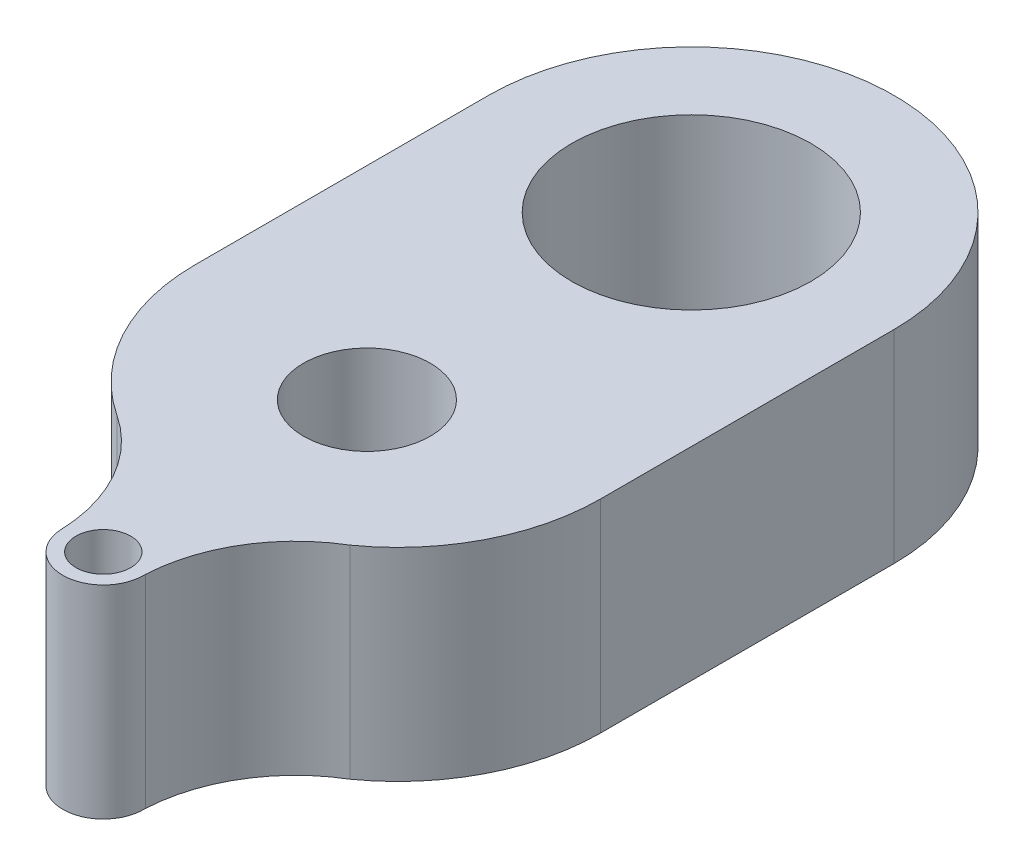
ISO-10303-21;
HEADER;
FILE_DESCRIPTION(('STEP AP214'),'2;1');
FILE_NAME('part.step','',(''),(''),'','','');
FILE_SCHEMA(('AUTOMOTIVE_DESIGN { 1 0 10303 214 1 1 1 1 }'));
ENDSEC;
DATA;
#1=APPLICATION_CONTEXT('core data for automotive mechanical design processes');
#2=APPLICATION_PROTOCOL_DEFINITION('international standard','automotive_design',2000,#1);
#3=PRODUCT_CONTEXT('',#1,'mechanical');
#4=PRODUCT('Part','Part','',(#3));
#5=PRODUCT_RELATED_PRODUCT_CATEGORY('part','',(#4));
#6=PRODUCT_DEFINITION_FORMATION('','',#4);
#7=PRODUCT_DEFINITION_CONTEXT('part definition',#1,'design');
#8=PRODUCT_DEFINITION('design','',#6,#7);
#9=PRODUCT_DEFINITION_SHAPE('','',#8);
#10=(LENGTH_UNIT() NAMED_UNIT(*) SI_UNIT(.MILLI.,.METRE.));
#11=(NAMED_UNIT(*) PLANE_ANGLE_UNIT() SI_UNIT($,.RADIAN.));
#12=(NAMED_UNIT(*) SI_UNIT($,.STERADIAN.) SOLID_ANGLE_UNIT());
#13=UNCERTAINTY_MEASURE_WITH_UNIT(LENGTH_MEASURE(1.E-05),#10,'distance_accuracy_value','');
#14=(GEOMETRIC_REPRESENTATION_CONTEXT(3) GLOBAL_UNCERTAINTY_ASSIGNED_CONTEXT((#13)) GLOBAL_UNIT_ASSIGNED_CONTEXT((#10,
#11,#12)) REPRESENTATION_CONTEXT('',''));
#15=CARTESIAN_POINT('',(0.,0.,0.));
#16=DIRECTION('',(0.,0.,1.));
#17=DIRECTION('',(1.,0.,0.));
#18=AXIS2_PLACEMENT_3D('',#15,#16,#17);
#19=CARTESIAN_POINT('',(1.27,1.27,0.));
#20=DIRECTION('',(1.,0.,0.));
#21=DIRECTION('',(0.,0.,-1.));
#22=AXIS2_PLACEMENT_3D('',#19,#20,#21);
#23=PLANE('',#22);
#24=DIRECTION('',(0.,0.,1.));
#25=VECTOR('',#24,1.);
#26=CARTESIAN_POINT('',(1.27,0.,0.));
#27=LINE('',#26,#25);
#28=CARTESIAN_POINT('',(1.27,0.,0.));
#29=VERTEX_POINT('',#28);
#30=CARTESIAN_POINT('',(1.27,0.,1.83849168136878));
#31=VERTEX_POINT('',#30);
#32=EDGE_CURVE('E148',#29,#31,#27,.T.);
#33=ORIENTED_EDGE('',*,*,#32,.F.);
#34=DIRECTION('',(0.,-1.,0.));
#35=VECTOR('',#34,1.);
#36=CARTESIAN_POINT('',(1.27,1.27,0.));
#37=LINE('',#36,#35);
#38=CARTESIAN_POINT('',(1.27,1.27,0.));
#39=VERTEX_POINT('',#38);
#40=EDGE_CURVE('E12',#39,#29,#37,.T.);
#41=ORIENTED_EDGE('',*,*,#40,.F.);
#42=DIRECTION('',(0.,0.,1.));
#43=VECTOR('',#42,1.);
#44=CARTESIAN_POINT('',(1.27,1.27,0.));
#45=LINE('',#44,#43);
#46=CARTESIAN_POINT('',(1.27,1.27,1.83849168136878));
#47=VERTEX_POINT('',#46);
#48=EDGE_CURVE('E175',#39,#47,#45,.T.);
#49=ORIENTED_EDGE('',*,*,#48,.T.);
#50=DIRECTION('',(0.,-1.,0.));
#51=VECTOR('',#50,1.);
#52=CARTESIAN_POINT('',(1.27,1.27,1.83849168136878));
#53=LINE('',#52,#51);
#54=EDGE_CURVE('E59',#47,#31,#53,.T.);
#55=ORIENTED_EDGE('',*,*,#54,.T.);
#56=EDGE_LOOP('',(#33,#41,#49,#55));
#57=FACE_BOUND('',#56,.T.);
#58=ADVANCED_FACE('F43',(#57),#23,.T.);
#59=CARTESIAN_POINT('',(0.,1.27,0.));
#60=DIRECTION('',(0.,-1.,0.));
#61=DIRECTION('',(0.,0.,-1.));
#62=AXIS2_PLACEMENT_3D('',#59,#60,#61);
#63=CYLINDRICAL_SURFACE('',#62,1.27);
#64=CARTESIAN_POINT('',(0.,0.,0.));
#65=DIRECTION('',(0.,1.,0.));
#66=DIRECTION('',(0.,0.,1.));
#67=AXIS2_PLACEMENT_3D('',#64,#65,#66);
#68=CIRCLE('',#67,1.27);
#69=CARTESIAN_POINT('',(-1.27,0.,0.));
#70=VERTEX_POINT('',#69);
#71=EDGE_CURVE('E150',#29,#70,#68,.T.);
#72=ORIENTED_EDGE('',*,*,#71,.T.);
#73=DIRECTION('',(0.,-1.,0.));
#74=VECTOR('',#73,1.);
#75=CARTESIAN_POINT('',(-1.27,1.27,0.));
#76=LINE('',#75,#74);
#77=CARTESIAN_POINT('',(-1.27,1.27,0.));
#78=VERTEX_POINT('',#77);
#79=EDGE_CURVE('E51',#78,#70,#76,.T.);
#80=ORIENTED_EDGE('',*,*,#79,.F.);
#81=CARTESIAN_POINT('',(0.,1.27,0.));
#82=DIRECTION('',(0.,1.,0.));
#83=DIRECTION('',(0.,0.,1.));
#84=AXIS2_PLACEMENT_3D('',#81,#82,#83);
#85=CIRCLE('',#84,1.27);
#86=EDGE_CURVE('E209',#39,#78,#85,.T.);
#87=ORIENTED_EDGE('',*,*,#86,.F.);
#88=ORIENTED_EDGE('',*,*,#40,.T.);
#89=EDGE_LOOP('',(#72,#80,#87,#88));
#90=FACE_BOUND('',#89,.T.);
#91=ADVANCED_FACE('F227',(#90),#63,.T.);
#92=CARTESIAN_POINT('',(-1.27,1.27,0.));
#93=DIRECTION('',(1.,0.,0.));
#94=DIRECTION('',(0.,0.,-1.));
#95=AXIS2_PLACEMENT_3D('',#92,#93,#94);
#96=PLANE('',#95);
#97=DIRECTION('',(0.,0.,1.));
#98=VECTOR('',#97,1.);
#99=CARTESIAN_POINT('',(-1.27,0.,0.));
#100=LINE('',#99,#98);
#101=CARTESIAN_POINT('',(-1.27,0.,1.83849168136878));
#102=VERTEX_POINT('',#101);
#103=EDGE_CURVE('E151',#70,#102,#100,.T.);
#104=ORIENTED_EDGE('',*,*,#103,.T.);
#105=DIRECTION('',(0.,-1.,0.));
#106=VECTOR('',#105,1.);
#107=CARTESIAN_POINT('',(-1.27,1.27,1.83849168136878));
#108=LINE('',#107,#106);
#109=CARTESIAN_POINT('',(-1.27,1.27,1.83849168136878));
#110=VERTEX_POINT('',#109);
#111=EDGE_CURVE('E182',#110,#102,#108,.T.);
#112=ORIENTED_EDGE('',*,*,#111,.F.);
#113=DIRECTION('',(0.,0.,1.));
#114=VECTOR('',#113,1.);
#115=CARTESIAN_POINT('',(-1.27,1.27,0.));
#116=LINE('',#115,#114);
#117=EDGE_CURVE('E191',#78,#110,#116,.T.);
#118=ORIENTED_EDGE('',*,*,#117,.F.);
#119=ORIENTED_EDGE('',*,*,#79,.T.);
#120=EDGE_LOOP('',(#104,#112,#118,#119));
#121=FACE_BOUND('',#120,.T.);
#122=ADVANCED_FACE('F189',(#121),#96,.F.);
#123=CARTESIAN_POINT('',(0.,1.27,1.83849168136878));
#124=DIRECTION('',(0.,-1.,0.));
#125=DIRECTION('',(0.,0.,-1.));
#126=AXIS2_PLACEMENT_3D('',#123,#124,#125);
#127=CYLINDRICAL_SURFACE('',#126,1.27);
#128=CARTESIAN_POINT('',(0.,0.,1.83849168136878));
#129=DIRECTION('',(0.,1.,0.));
#130=DIRECTION('',(0.,0.,1.));
#131=AXIS2_PLACEMENT_3D('',#128,#129,#130);
#132=CIRCLE('',#131,1.27);
#133=CARTESIAN_POINT('',(-0.699177918542885,0.,2.8987040366175));
#134=VERTEX_POINT('',#133);
#135=EDGE_CURVE('E155',#102,#134,#132,.T.);
#136=ORIENTED_EDGE('',*,*,#135,.T.);
#137=DIRECTION('',(0.,-1.,0.));
#138=VECTOR('',#137,1.);
#139=CARTESIAN_POINT('',(-0.699177918542885,1.27,2.8987040366175));
#140=LINE('',#139,#138);
#141=CARTESIAN_POINT('',(-0.699177918542885,1.27,2.8987040366175));
#142=VERTEX_POINT('',#141);
#143=EDGE_CURVE('E179',#142,#134,#140,.T.);
#144=ORIENTED_EDGE('',*,*,#143,.F.);
#145=CARTESIAN_POINT('',(0.,1.27,1.83849168136878));
#146=DIRECTION('',(0.,1.,0.));
#147=DIRECTION('',(0.,0.,1.));
#148=AXIS2_PLACEMENT_3D('',#145,#146,#147);
#149=CIRCLE('',#148,1.27);
#150=EDGE_CURVE('E205',#110,#142,#149,.T.);
#151=ORIENTED_EDGE('',*,*,#150,.F.);
#152=ORIENTED_EDGE('',*,*,#111,.T.);
#153=EDGE_LOOP('',(#136,#144,#151,#152));
#154=FACE_BOUND('',#153,.T.);
#155=ADVANCED_FACE('F201',(#154),#127,.T.);
#156=CARTESIAN_POINT('',(-1.24541066740451,1.27,3.72699493915557));
#157=DIRECTION('',(0.,-1.,0.));
#158=DIRECTION('',(0.,0.,-1.));
#159=AXIS2_PLACEMENT_3D('',#156,#157,#158);
#160=CYLINDRICAL_SURFACE('',#159,0.9921875);
#161=CARTESIAN_POINT('',(-1.24541066740451,0.,3.72699493915557));
#162=DIRECTION('',(0.,1.,0.));
#163=DIRECTION('',(0.,0.,1.));
#164=AXIS2_PLACEMENT_3D('',#161,#162,#163);
#165=CIRCLE('',#164,0.9921875);
#166=CARTESIAN_POINT('',(-0.253841664693913,0.,3.6919671213566));
#167=VERTEX_POINT('',#166);
#168=EDGE_CURVE('E158',#134,#167,#165,.F.);
#169=ORIENTED_EDGE('',*,*,#168,.T.);
#170=DIRECTION('',(0.,-1.,0.));
#171=VECTOR('',#170,1.);
#172=CARTESIAN_POINT('',(-0.253841664693913,1.27,3.6919671213566));
#173=LINE('',#172,#171);
#174=CARTESIAN_POINT('',(-0.253841664693913,1.27,3.6919671213566));
#175=VERTEX_POINT('',#174);
#176=EDGE_CURVE('E131',#175,#167,#173,.T.);
#177=ORIENTED_EDGE('',*,*,#176,.F.);
#178=CARTESIAN_POINT('',(-1.24541066740451,1.27,3.72699493915557));
#179=DIRECTION('',(0.,1.,0.));
#180=DIRECTION('',(0.,0.,1.));
#181=AXIS2_PLACEMENT_3D('',#178,#179,#180);
#182=CIRCLE('',#181,0.9921875);
#183=EDGE_CURVE('E119',#142,#175,#182,.F.);
#184=ORIENTED_EDGE('',*,*,#183,.F.);
#185=ORIENTED_EDGE('',*,*,#143,.T.);
#186=EDGE_LOOP('',(#169,#177,#184,#185));
#187=FACE_BOUND('',#186,.T.);
#188=ADVANCED_FACE('F204',(#187),#160,.F.);
#189=CARTESIAN_POINT('',(0.,1.27,3.68300000000006));
#190=DIRECTION('',(0.,-1.,0.));
#191=DIRECTION('',(0.,0.,-1.));
#192=AXIS2_PLACEMENT_3D('',#189,#190,#191);
#193=CYLINDRICAL_SURFACE('',#192,0.254);
#194=CARTESIAN_POINT('',(0.,0.,3.68300000000006));
#195=DIRECTION('',(0.,1.,0.));
#196=DIRECTION('',(0.,0.,1.));
#197=AXIS2_PLACEMENT_3D('',#194,#195,#196);
#198=CIRCLE('',#197,0.254);
#199=CARTESIAN_POINT('',(0.253841664693914,0.,3.67403287864353));
#200=VERTEX_POINT('',#199);
#201=EDGE_CURVE('E128',#167,#200,#198,.T.);
#202=ORIENTED_EDGE('',*,*,#201,.T.);
#203=DIRECTION('',(0.,-1.,0.));
#204=VECTOR('',#203,1.);
#205=CARTESIAN_POINT('',(0.253841664693914,1.27,3.67403287864353));
#206=LINE('',#205,#204);
#207=CARTESIAN_POINT('',(0.253841664693914,1.27,3.67403287864353));
#208=VERTEX_POINT('',#207);
#209=EDGE_CURVE('E125',#208,#200,#206,.T.);
#210=ORIENTED_EDGE('',*,*,#209,.F.);
#211=CARTESIAN_POINT('',(0.,1.27,3.68300000000006));
#212=DIRECTION('',(0.,1.,0.));
#213=DIRECTION('',(0.,0.,1.));
#214=AXIS2_PLACEMENT_3D('',#211,#212,#213);
#215=CIRCLE('',#214,0.254);
#216=EDGE_CURVE('E110',#175,#208,#215,.T.);
#217=ORIENTED_EDGE('',*,*,#216,.F.);
#218=ORIENTED_EDGE('',*,*,#176,.T.);
#219=EDGE_LOOP('',(#202,#210,#217,#218));
#220=FACE_BOUND('',#219,.T.);
#221=ADVANCED_FACE('F126',(#220),#193,.T.);
#222=CARTESIAN_POINT('',(1.24469738906509,1.27,3.72542323413099));
#223=DIRECTION('',(0.,-1.,0.));
#224=DIRECTION('',(0.,0.,-1.));
#225=AXIS2_PLACEMENT_3D('',#222,#223,#224);
#226=CYLINDRICAL_SURFACE('',#225,0.992187500000001);
#227=CARTESIAN_POINT('',(1.24469738906509,0.,3.72542323413099));
#228=DIRECTION('',(0.,1.,0.));
#229=DIRECTION('',(0.,0.,1.));
#230=AXIS2_PLACEMENT_3D('',#227,#228,#229);
#231=CIRCLE('',#230,0.992187500000001);
#232=CARTESIAN_POINT('',(0.735263157894737,0.,2.8740051234074));
#233=VERTEX_POINT('',#232);
#234=EDGE_CURVE('E161',#233,#200,#231,.T.);
#235=ORIENTED_EDGE('',*,*,#234,.F.);
#236=DIRECTION('',(0.,-1.,0.));
#237=VECTOR('',#236,1.);
#238=CARTESIAN_POINT('',(0.735263157894737,1.27,2.8740051234074));
#239=LINE('',#238,#237);
#240=CARTESIAN_POINT('',(0.735263157894737,1.27,2.8740051234074));
#241=VERTEX_POINT('',#240);
#242=EDGE_CURVE('E84',#241,#233,#239,.T.);
#243=ORIENTED_EDGE('',*,*,#242,.F.);
#244=CARTESIAN_POINT('',(1.24469738906509,1.27,3.72542323413099));
#245=DIRECTION('',(0.,1.,0.));
#246=DIRECTION('',(0.,0.,1.));
#247=AXIS2_PLACEMENT_3D('',#244,#245,#246);
#248=CIRCLE('',#247,0.992187500000001);
#249=EDGE_CURVE('E117',#241,#208,#248,.T.);
#250=ORIENTED_EDGE('',*,*,#249,.T.);
#251=ORIENTED_EDGE('',*,*,#209,.T.);
#252=EDGE_LOOP('',(#235,#243,#250,#251));
#253=FACE_BOUND('',#252,.T.);
#254=ADVANCED_FACE('F133',(#253),#226,.F.);
#255=CARTESIAN_POINT('',(0.,1.27,0.));
#256=DIRECTION('',(0.,-1.,0.));
#257=DIRECTION('',(0.,0.,-1.));
#258=AXIS2_PLACEMENT_3D('',#255,#256,#257);
#259=CYLINDRICAL_SURFACE('',#258,0.749300000000012);
#260=CARTESIAN_POINT('',(0.,1.27,0.));
#261=DIRECTION('',(0.,1.,0.));
#262=DIRECTION('',(0.,0.,1.));
#263=AXIS2_PLACEMENT_3D('',#260,#261,#262);
#264=CIRCLE('',#263,0.749300000000012);
#265=CARTESIAN_POINT('',(0.,1.27,0.749300000000012));
#266=VERTEX_POINT('',#265);
#267=EDGE_CURVE('E142',#266,#266,#264,.T.);
#268=ORIENTED_EDGE('',*,*,#267,.T.);
#269=EDGE_LOOP('',(#268));
#270=FACE_BOUND('',#269,.T.);
#271=CARTESIAN_POINT('',(0.,0.,0.));
#272=DIRECTION('',(0.,1.,0.));
#273=DIRECTION('',(0.,0.,1.));
#274=AXIS2_PLACEMENT_3D('',#271,#272,#273);
#275=CIRCLE('',#274,0.749300000000012);
#276=CARTESIAN_POINT('',(0.,0.,0.749300000000012));
#277=VERTEX_POINT('',#276);
#278=EDGE_CURVE('E169',#277,#277,#275,.T.);
#279=ORIENTED_EDGE('',*,*,#278,.F.);
#280=EDGE_LOOP('',(#279));
#281=FACE_BOUND('',#280,.T.);
#282=ADVANCED_FACE('F222',(#270,#281),#259,.F.);
#283=CARTESIAN_POINT('',(0.,1.27,2.03200000000006));
#284=DIRECTION('',(0.,-1.,0.));
#285=DIRECTION('',(0.,0.,-1.));
#286=AXIS2_PLACEMENT_3D('',#283,#284,#285);
#287=CYLINDRICAL_SURFACE('',#286,0.396875);
#288=CARTESIAN_POINT('',(0.,1.27,2.03200000000006));
#289=DIRECTION('',(0.,1.,0.));
#290=DIRECTION('',(0.,0.,1.));
#291=AXIS2_PLACEMENT_3D('',#288,#289,#290);
#292=CIRCLE('',#291,0.396875);
#293=CARTESIAN_POINT('',(0.,1.27,2.42887500000006));
#294=VERTEX_POINT('',#293);
#295=EDGE_CURVE('E136',#294,#294,#292,.T.);
#296=ORIENTED_EDGE('',*,*,#295,.T.);
#297=EDGE_LOOP('',(#296));
#298=FACE_BOUND('',#297,.T.);
#299=CARTESIAN_POINT('',(0.,0.,2.03200000000006));
#300=DIRECTION('',(0.,1.,0.));
#301=DIRECTION('',(0.,0.,1.));
#302=AXIS2_PLACEMENT_3D('',#299,#300,#301);
#303=CIRCLE('',#302,0.396875);
#304=CARTESIAN_POINT('',(0.,0.,2.42887500000006));
#305=VERTEX_POINT('',#304);
#306=EDGE_CURVE('E166',#305,#305,#303,.T.);
#307=ORIENTED_EDGE('',*,*,#306,.F.);
#308=EDGE_LOOP('',(#307));
#309=FACE_BOUND('',#308,.T.);
#310=ADVANCED_FACE('F214',(#298,#309),#287,.F.);
#311=CARTESIAN_POINT('',(0.,1.27,1.83849168136878));
#312=DIRECTION('',(0.,-1.,0.));
#313=DIRECTION('',(0.,0.,-1.));
#314=AXIS2_PLACEMENT_3D('',#311,#312,#313);
#315=CYLINDRICAL_SURFACE('',#314,1.27);
#316=CARTESIAN_POINT('',(0.,0.,1.83849168136878));
#317=DIRECTION('',(0.,1.,0.));
#318=DIRECTION('',(0.,0.,1.));
#319=AXIS2_PLACEMENT_3D('',#316,#317,#318);
#320=CIRCLE('',#319,1.27);
#321=EDGE_CURVE('E163',#31,#233,#320,.F.);
#322=ORIENTED_EDGE('',*,*,#321,.F.);
#323=ORIENTED_EDGE('',*,*,#54,.F.);
#324=CARTESIAN_POINT('',(0.,1.27,1.83849168136878));
#325=DIRECTION('',(0.,1.,0.));
#326=DIRECTION('',(0.,0.,1.));
#327=AXIS2_PLACEMENT_3D('',#324,#325,#326);
#328=CIRCLE('',#327,1.27);
#329=EDGE_CURVE('E134',#47,#241,#328,.F.);
#330=ORIENTED_EDGE('',*,*,#329,.T.);
#331=ORIENTED_EDGE('',*,*,#242,.T.);
#332=EDGE_LOOP('',(#322,#323,#330,#331));
#333=FACE_BOUND('',#332,.T.);
#334=ADVANCED_FACE('F211',(#333),#315,.T.);
#335=CARTESIAN_POINT('',(0.,1.27,3.68300000000006));
#336=DIRECTION('',(0.,-1.,0.));
#337=DIRECTION('',(0.,0.,-1.));
#338=AXIS2_PLACEMENT_3D('',#335,#336,#337);
#339=CYLINDRICAL_SURFACE('',#338,0.17145);
#340=CARTESIAN_POINT('',(0.,1.27,3.68300000000006));
#341=DIRECTION('',(0.,1.,0.));
#342=DIRECTION('',(0.,0.,1.));
#343=AXIS2_PLACEMENT_3D('',#340,#341,#342);
#344=CIRCLE('',#343,0.17145);
#345=CARTESIAN_POINT('',(0.,1.27,3.85445000000006));
#346=VERTEX_POINT('',#345);
#347=EDGE_CURVE('E145',#346,#346,#344,.T.);
#348=ORIENTED_EDGE('',*,*,#347,.T.);
#349=EDGE_LOOP('',(#348));
#350=FACE_BOUND('',#349,.T.);
#351=CARTESIAN_POINT('',(0.,0.,3.68300000000006));
#352=DIRECTION('',(0.,1.,0.));
#353=DIRECTION('',(0.,0.,1.));
#354=AXIS2_PLACEMENT_3D('',#351,#352,#353);
#355=CIRCLE('',#354,0.17145);
#356=CARTESIAN_POINT('',(0.,0.,3.85445000000006));
#357=VERTEX_POINT('',#356);
#358=EDGE_CURVE('E172',#357,#357,#355,.T.);
#359=ORIENTED_EDGE('',*,*,#358,.F.);
#360=EDGE_LOOP('',(#359));
#361=FACE_BOUND('',#360,.T.);
#362=ADVANCED_FACE('F213',(#350,#361),#339,.F.);
#363=CARTESIAN_POINT('',(0.,1.27,0.));
#364=DIRECTION('',(0.,1.,0.));
#365=DIRECTION('',(0.,0.,1.));
#366=AXIS2_PLACEMENT_3D('',#363,#364,#365);
#367=PLANE('',#366);
#368=ORIENTED_EDGE('',*,*,#48,.F.);
#369=ORIENTED_EDGE('',*,*,#86,.T.);
#370=ORIENTED_EDGE('',*,*,#117,.T.);
#371=ORIENTED_EDGE('',*,*,#150,.T.);
#372=ORIENTED_EDGE('',*,*,#183,.T.);
#373=ORIENTED_EDGE('',*,*,#216,.T.);
#374=ORIENTED_EDGE('',*,*,#249,.F.);
#375=ORIENTED_EDGE('',*,*,#329,.F.);
#376=EDGE_LOOP('',(#368,#369,#370,#371,#372,#373,#374,#375));
#377=FACE_BOUND('',#376,.T.);
#378=ORIENTED_EDGE('',*,*,#295,.F.);
#379=EDGE_LOOP('',(#378));
#380=FACE_BOUND('',#379,.T.);
#381=ORIENTED_EDGE('',*,*,#267,.F.);
#382=EDGE_LOOP('',(#381));
#383=FACE_BOUND('',#382,.T.);
#384=ORIENTED_EDGE('',*,*,#347,.F.);
#385=EDGE_LOOP('',(#384));
#386=FACE_BOUND('',#385,.T.);
#387=ADVANCED_FACE('F113',(#377,#380,#383,#386),#367,.T.);
#388=CARTESIAN_POINT('',(0.,0.,0.));
#389=DIRECTION('',(0.,1.,0.));
#390=DIRECTION('',(0.,0.,1.));
#391=AXIS2_PLACEMENT_3D('',#388,#389,#390);
#392=PLANE('',#391);
#393=ORIENTED_EDGE('',*,*,#32,.T.);
#394=ORIENTED_EDGE('',*,*,#321,.T.);
#395=ORIENTED_EDGE('',*,*,#234,.T.);
#396=ORIENTED_EDGE('',*,*,#201,.F.);
#397=ORIENTED_EDGE('',*,*,#168,.F.);
#398=ORIENTED_EDGE('',*,*,#135,.F.);
#399=ORIENTED_EDGE('',*,*,#103,.F.);
#400=ORIENTED_EDGE('',*,*,#71,.F.);
#401=EDGE_LOOP('',(#393,#394,#395,#396,#397,#398,#399,#400));
#402=FACE_BOUND('',#401,.T.);
#403=ORIENTED_EDGE('',*,*,#306,.T.);
#404=EDGE_LOOP('',(#403));
#405=FACE_BOUND('',#404,.T.);
#406=ORIENTED_EDGE('',*,*,#278,.T.);
#407=EDGE_LOOP('',(#406));
#408=FACE_BOUND('',#407,.T.);
#409=ORIENTED_EDGE('',*,*,#358,.T.);
#410=EDGE_LOOP('',(#409));
#411=FACE_BOUND('',#410,.T.);
#412=ADVANCED_FACE('F196',(#402,#405,#408,#411),#392,.F.);
#413=CLOSED_SHELL('',(#58,#91,#122,#155,#188,#221,#254,#282,#310,#334,#362,#387,#412));
#414=MANIFOLD_SOLID_BREP('B2',#413);
#415=ADVANCED_BREP_SHAPE_REPRESENTATION('',(#18,#414),#14);
#416=SHAPE_DEFINITION_REPRESENTATION(#9,#415);
ENDSEC;
END-ISO-10303-21;
